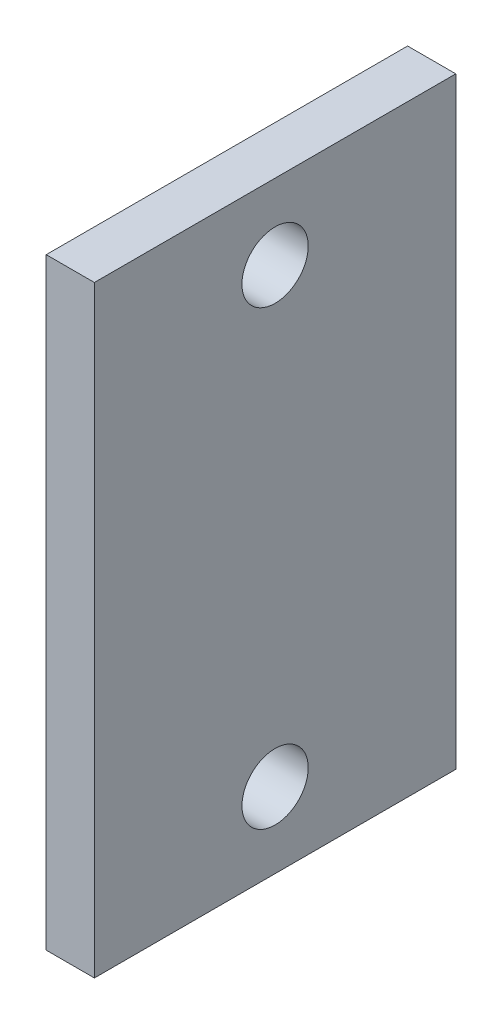
ISO-10303-21;
HEADER;
FILE_DESCRIPTION(('STEP AP214'),'2;1');
FILE_NAME('part.step','',(''),(''),'','','');
FILE_SCHEMA(('AUTOMOTIVE_DESIGN { 1 0 10303 214 1 1 1 1 }'));
ENDSEC;
DATA;
#1=APPLICATION_CONTEXT('core data for automotive mechanical design processes');
#2=APPLICATION_PROTOCOL_DEFINITION('international standard','automotive_design',2000,#1);
#3=PRODUCT_CONTEXT('',#1,'mechanical');
#4=PRODUCT('Part','Part','',(#3));
#5=PRODUCT_RELATED_PRODUCT_CATEGORY('part','',(#4));
#6=PRODUCT_DEFINITION_FORMATION('','',#4);
#7=PRODUCT_DEFINITION_CONTEXT('part definition',#1,'design');
#8=PRODUCT_DEFINITION('design','',#6,#7);
#9=PRODUCT_DEFINITION_SHAPE('','',#8);
#10=(LENGTH_UNIT() NAMED_UNIT(*) SI_UNIT(.MILLI.,.METRE.));
#11=(NAMED_UNIT(*) PLANE_ANGLE_UNIT() SI_UNIT($,.RADIAN.));
#12=(NAMED_UNIT(*) SI_UNIT($,.STERADIAN.) SOLID_ANGLE_UNIT());
#13=UNCERTAINTY_MEASURE_WITH_UNIT(LENGTH_MEASURE(1.E-05),#10,'distance_accuracy_value','');
#14=(GEOMETRIC_REPRESENTATION_CONTEXT(3) GLOBAL_UNCERTAINTY_ASSIGNED_CONTEXT((#13)) GLOBAL_UNIT_ASSIGNED_CONTEXT((#10,
#11,#12)) REPRESENTATION_CONTEXT('',''));
#15=CARTESIAN_POINT('',(0.,0.,0.));
#16=DIRECTION('',(0.,0.,1.));
#17=DIRECTION('',(1.,0.,0.));
#18=AXIS2_PLACEMENT_3D('',#15,#16,#17);
#19=CARTESIAN_POINT('',(0.,0.,0.));
#20=DIRECTION('',(-1.,0.,0.));
#21=DIRECTION('',(0.,0.,1.));
#22=AXIS2_PLACEMENT_3D('',#19,#20,#21);
#23=PLANE('',#22);
#24=CARTESIAN_POINT('',(0.,-7.5,0.));
#25=DIRECTION('',(-1.,0.,0.));
#26=DIRECTION('',(0.,0.,1.));
#27=AXIS2_PLACEMENT_3D('',#24,#25,#26);
#28=CIRCLE('',#27,1.1);
#29=CARTESIAN_POINT('',(0.,-7.5,1.1));
#30=VERTEX_POINT('',#29);
#31=EDGE_CURVE('E149',#30,#30,#28,.F.);
#32=ORIENTED_EDGE('',*,*,#31,.T.);
#33=EDGE_LOOP('',(#32));
#34=FACE_BOUND('',#33,.T.);
#35=CARTESIAN_POINT('',(0.,7.5,0.));
#36=DIRECTION('',(-1.,0.,0.));
#37=DIRECTION('',(0.,0.,1.));
#38=AXIS2_PLACEMENT_3D('',#35,#36,#37);
#39=CIRCLE('',#38,1.1);
#40=CARTESIAN_POINT('',(0.,7.5,1.1));
#41=VERTEX_POINT('',#40);
#42=EDGE_CURVE('E244',#41,#41,#39,.F.);
#43=ORIENTED_EDGE('',*,*,#42,.T.);
#44=EDGE_LOOP('',(#43));
#45=FACE_BOUND('',#44,.T.);
#46=DIRECTION('',(0.,1.,0.));
#47=VECTOR('',#46,1.);
#48=CARTESIAN_POINT('',(0.,-10.,-6.));
#49=LINE('',#48,#47);
#50=CARTESIAN_POINT('',(0.,-10.,-6.));
#51=VERTEX_POINT('',#50);
#52=CARTESIAN_POINT('',(0.,10.,-6.));
#53=VERTEX_POINT('',#52);
#54=EDGE_CURVE('E157',#51,#53,#49,.T.);
#55=ORIENTED_EDGE('',*,*,#54,.F.);
#56=DIRECTION('',(0.,0.,-1.));
#57=VECTOR('',#56,1.);
#58=CARTESIAN_POINT('',(0.,-10.,6.));
#59=LINE('',#58,#57);
#60=CARTESIAN_POINT('',(0.,-10.,6.));
#61=VERTEX_POINT('',#60);
#62=EDGE_CURVE('E95',#61,#51,#59,.T.);
#63=ORIENTED_EDGE('',*,*,#62,.F.);
#64=DIRECTION('',(0.,-1.,0.));
#65=VECTOR('',#64,1.);
#66=CARTESIAN_POINT('',(0.,-10.,6.));
#67=LINE('',#66,#65);
#68=CARTESIAN_POINT('',(0.,10.,6.));
#69=VERTEX_POINT('',#68);
#70=EDGE_CURVE('E171',#69,#61,#67,.T.);
#71=ORIENTED_EDGE('',*,*,#70,.F.);
#72=DIRECTION('',(0.,0.,1.));
#73=VECTOR('',#72,1.);
#74=CARTESIAN_POINT('',(0.,10.,6.));
#75=LINE('',#74,#73);
#76=EDGE_CURVE('E174',#53,#69,#75,.T.);
#77=ORIENTED_EDGE('',*,*,#76,.F.);
#78=EDGE_LOOP('',(#55,#63,#71,#77));
#79=FACE_BOUND('',#78,.T.);
#80=DIRECTION('',(0.,0.,1.));
#81=VECTOR('',#80,1.);
#82=CARTESIAN_POINT('',(0.,1.75,-1.4));
#83=LINE('',#82,#81);
#84=CARTESIAN_POINT('',(0.,1.75,-1.4));
#85=VERTEX_POINT('',#84);
#86=CARTESIAN_POINT('',(0.,1.75,1.4));
#87=VERTEX_POINT('',#86);
#88=EDGE_CURVE('E141',#85,#87,#83,.T.);
#89=ORIENTED_EDGE('',*,*,#88,.T.);
#90=DIRECTION('',(0.,-1.,0.));
#91=VECTOR('',#90,1.);
#92=CARTESIAN_POINT('',(0.,1.75,1.4));
#93=LINE('',#92,#91);
#94=CARTESIAN_POINT('',(0.,-1.75,1.4));
#95=VERTEX_POINT('',#94);
#96=EDGE_CURVE('E64',#87,#95,#93,.T.);
#97=ORIENTED_EDGE('',*,*,#96,.T.);
#98=DIRECTION('',(0.,0.,-1.));
#99=VECTOR('',#98,1.);
#100=CARTESIAN_POINT('',(0.,-1.75,1.4));
#101=LINE('',#100,#99);
#102=CARTESIAN_POINT('',(0.,-1.75,-1.4));
#103=VERTEX_POINT('',#102);
#104=EDGE_CURVE('E127',#95,#103,#101,.T.);
#105=ORIENTED_EDGE('',*,*,#104,.T.);
#106=DIRECTION('',(0.,1.,0.));
#107=VECTOR('',#106,1.);
#108=CARTESIAN_POINT('',(0.,-1.75,-1.4));
#109=LINE('',#108,#107);
#110=EDGE_CURVE('E148',#103,#85,#109,.T.);
#111=ORIENTED_EDGE('',*,*,#110,.T.);
#112=EDGE_LOOP('',(#89,#97,#105,#111));
#113=FACE_BOUND('',#112,.T.);
#114=ADVANCED_FACE('F50',(#34,#45,#79,#113),#23,.T.);
#115=CARTESIAN_POINT('',(1.6,-10.,-6.));
#116=DIRECTION('',(0.,0.,1.));
#117=DIRECTION('',(1.,0.,0.));
#118=AXIS2_PLACEMENT_3D('',#115,#116,#117);
#119=PLANE('',#118);
#120=ORIENTED_EDGE('',*,*,#54,.T.);
#121=DIRECTION('',(-1.,0.,0.));
#122=VECTOR('',#121,1.);
#123=CARTESIAN_POINT('',(1.6,10.,-6.));
#124=LINE('',#123,#122);
#125=CARTESIAN_POINT('',(1.6,10.,-6.));
#126=VERTEX_POINT('',#125);
#127=EDGE_CURVE('E11',#126,#53,#124,.T.);
#128=ORIENTED_EDGE('',*,*,#127,.F.);
#129=DIRECTION('',(0.,1.,0.));
#130=VECTOR('',#129,1.);
#131=CARTESIAN_POINT('',(1.6,-10.,-6.));
#132=LINE('',#131,#130);
#133=CARTESIAN_POINT('',(1.6,-10.,-6.));
#134=VERTEX_POINT('',#133);
#135=EDGE_CURVE('E162',#134,#126,#132,.T.);
#136=ORIENTED_EDGE('',*,*,#135,.F.);
#137=DIRECTION('',(-1.,0.,0.));
#138=VECTOR('',#137,1.);
#139=CARTESIAN_POINT('',(1.6,-10.,-6.));
#140=LINE('',#139,#138);
#141=EDGE_CURVE('E166',#134,#51,#140,.T.);
#142=ORIENTED_EDGE('',*,*,#141,.T.);
#143=EDGE_LOOP('',(#120,#128,#136,#142));
#144=FACE_BOUND('',#143,.T.);
#145=ADVANCED_FACE('F47',(#144),#119,.F.);
#146=CARTESIAN_POINT('',(1.6,10.,6.));
#147=DIRECTION('',(0.,-1.,0.));
#148=DIRECTION('',(0.,0.,-1.));
#149=AXIS2_PLACEMENT_3D('',#146,#147,#148);
#150=PLANE('',#149);
#151=ORIENTED_EDGE('',*,*,#76,.T.);
#152=DIRECTION('',(-1.,0.,0.));
#153=VECTOR('',#152,1.);
#154=CARTESIAN_POINT('',(1.6,10.,6.));
#155=LINE('',#154,#153);
#156=CARTESIAN_POINT('',(1.6,10.,6.));
#157=VERTEX_POINT('',#156);
#158=EDGE_CURVE('E54',#157,#69,#155,.T.);
#159=ORIENTED_EDGE('',*,*,#158,.F.);
#160=DIRECTION('',(0.,0.,1.));
#161=VECTOR('',#160,1.);
#162=CARTESIAN_POINT('',(1.6,10.,6.));
#163=LINE('',#162,#161);
#164=EDGE_CURVE('E97',#126,#157,#163,.T.);
#165=ORIENTED_EDGE('',*,*,#164,.F.);
#166=ORIENTED_EDGE('',*,*,#127,.T.);
#167=EDGE_LOOP('',(#151,#159,#165,#166));
#168=FACE_BOUND('',#167,.T.);
#169=ADVANCED_FACE('F205',(#168),#150,.F.);
#170=CARTESIAN_POINT('',(1.6,-10.,6.));
#171=DIRECTION('',(0.,0.,-1.));
#172=DIRECTION('',(-1.,0.,0.));
#173=AXIS2_PLACEMENT_3D('',#170,#171,#172);
#174=PLANE('',#173);
#175=ORIENTED_EDGE('',*,*,#70,.T.);
#176=DIRECTION('',(-1.,0.,0.));
#177=VECTOR('',#176,1.);
#178=CARTESIAN_POINT('',(1.6,-10.,6.));
#179=LINE('',#178,#177);
#180=CARTESIAN_POINT('',(1.6,-10.,6.));
#181=VERTEX_POINT('',#180);
#182=EDGE_CURVE('E177',#181,#61,#179,.T.);
#183=ORIENTED_EDGE('',*,*,#182,.F.);
#184=DIRECTION('',(0.,-1.,0.));
#185=VECTOR('',#184,1.);
#186=CARTESIAN_POINT('',(1.6,-10.,6.));
#187=LINE('',#186,#185);
#188=EDGE_CURVE('E167',#157,#181,#187,.T.);
#189=ORIENTED_EDGE('',*,*,#188,.F.);
#190=ORIENTED_EDGE('',*,*,#158,.T.);
#191=EDGE_LOOP('',(#175,#183,#189,#190));
#192=FACE_BOUND('',#191,.T.);
#193=ADVANCED_FACE('F181',(#192),#174,.F.);
#194=CARTESIAN_POINT('',(1.6,-10.,6.));
#195=DIRECTION('',(0.,1.,0.));
#196=DIRECTION('',(0.,0.,1.));
#197=AXIS2_PLACEMENT_3D('',#194,#195,#196);
#198=PLANE('',#197);
#199=ORIENTED_EDGE('',*,*,#62,.T.);
#200=ORIENTED_EDGE('',*,*,#141,.F.);
#201=DIRECTION('',(0.,0.,-1.));
#202=VECTOR('',#201,1.);
#203=CARTESIAN_POINT('',(1.6,-10.,6.));
#204=LINE('',#203,#202);
#205=EDGE_CURVE('E72',#181,#134,#204,.T.);
#206=ORIENTED_EDGE('',*,*,#205,.F.);
#207=ORIENTED_EDGE('',*,*,#182,.T.);
#208=EDGE_LOOP('',(#199,#200,#206,#207));
#209=FACE_BOUND('',#208,.T.);
#210=ADVANCED_FACE('F191',(#209),#198,.F.);
#211=CARTESIAN_POINT('',(1.6,0.,0.));
#212=DIRECTION('',(-1.,0.,0.));
#213=DIRECTION('',(0.,0.,1.));
#214=AXIS2_PLACEMENT_3D('',#211,#212,#213);
#215=PLANE('',#214);
#216=CARTESIAN_POINT('',(1.6,-7.5,0.));
#217=DIRECTION('',(1.,0.,0.));
#218=DIRECTION('',(0.,0.,-1.));
#219=AXIS2_PLACEMENT_3D('',#216,#217,#218);
#220=CIRCLE('',#219,1.1);
#221=CARTESIAN_POINT('',(1.6,-7.5,-1.1));
#222=VERTEX_POINT('',#221);
#223=EDGE_CURVE('E242',#222,#222,#220,.T.);
#224=ORIENTED_EDGE('',*,*,#223,.F.);
#225=EDGE_LOOP('',(#224));
#226=FACE_BOUND('',#225,.T.);
#227=CARTESIAN_POINT('',(1.6,7.5,0.));
#228=DIRECTION('',(1.,0.,0.));
#229=DIRECTION('',(0.,0.,-1.));
#230=AXIS2_PLACEMENT_3D('',#227,#228,#229);
#231=CIRCLE('',#230,1.1);
#232=CARTESIAN_POINT('',(1.6,7.5,-1.1));
#233=VERTEX_POINT('',#232);
#234=EDGE_CURVE('E245',#233,#233,#231,.T.);
#235=ORIENTED_EDGE('',*,*,#234,.F.);
#236=EDGE_LOOP('',(#235));
#237=FACE_BOUND('',#236,.T.);
#238=ORIENTED_EDGE('',*,*,#135,.T.);
#239=ORIENTED_EDGE('',*,*,#164,.T.);
#240=ORIENTED_EDGE('',*,*,#188,.T.);
#241=ORIENTED_EDGE('',*,*,#205,.T.);
#242=EDGE_LOOP('',(#238,#239,#240,#241));
#243=FACE_BOUND('',#242,.T.);
#244=ADVANCED_FACE('F192',(#226,#237,#243),#215,.F.);
#245=CARTESIAN_POINT('',(-1.2,1.75,1.4));
#246=DIRECTION('',(0.,0.,1.));
#247=DIRECTION('',(1.,0.,0.));
#248=AXIS2_PLACEMENT_3D('',#245,#246,#247);
#249=PLANE('',#248);
#250=ORIENTED_EDGE('',*,*,#96,.F.);
#251=DIRECTION('',(1.,0.,0.));
#252=VECTOR('',#251,1.);
#253=CARTESIAN_POINT('',(-1.2,1.75,1.4));
#254=LINE('',#253,#252);
#255=CARTESIAN_POINT('',(-1.2,1.75,1.4));
#256=VERTEX_POINT('',#255);
#257=EDGE_CURVE('E142',#256,#87,#254,.T.);
#258=ORIENTED_EDGE('',*,*,#257,.F.);
#259=DIRECTION('',(0.,-1.,0.));
#260=VECTOR('',#259,1.);
#261=CARTESIAN_POINT('',(-1.2,1.75,1.4));
#262=LINE('',#261,#260);
#263=CARTESIAN_POINT('',(-1.2,-1.75,1.4));
#264=VERTEX_POINT('',#263);
#265=EDGE_CURVE('E136',#256,#264,#262,.T.);
#266=ORIENTED_EDGE('',*,*,#265,.T.);
#267=DIRECTION('',(1.,0.,0.));
#268=VECTOR('',#267,1.);
#269=CARTESIAN_POINT('',(-1.2,-1.75,1.4));
#270=LINE('',#269,#268);
#271=EDGE_CURVE('E121',#264,#95,#270,.T.);
#272=ORIENTED_EDGE('',*,*,#271,.T.);
#273=EDGE_LOOP('',(#250,#258,#266,#272));
#274=FACE_BOUND('',#273,.T.);
#275=ADVANCED_FACE('F143',(#274),#249,.T.);
#276=CARTESIAN_POINT('',(-1.2,1.75,-1.4));
#277=DIRECTION('',(0.,1.,0.));
#278=DIRECTION('',(0.,0.,1.));
#279=AXIS2_PLACEMENT_3D('',#276,#277,#278);
#280=PLANE('',#279);
#281=ORIENTED_EDGE('',*,*,#88,.F.);
#282=DIRECTION('',(1.,0.,0.));
#283=VECTOR('',#282,1.);
#284=CARTESIAN_POINT('',(-1.2,1.75,-1.4));
#285=LINE('',#284,#283);
#286=CARTESIAN_POINT('',(-1.2,1.75,-1.4));
#287=VERTEX_POINT('',#286);
#288=EDGE_CURVE('E159',#287,#85,#285,.T.);
#289=ORIENTED_EDGE('',*,*,#288,.F.);
#290=DIRECTION('',(0.,0.,1.));
#291=VECTOR('',#290,1.);
#292=CARTESIAN_POINT('',(-1.2,1.75,-1.4));
#293=LINE('',#292,#291);
#294=EDGE_CURVE('E129',#287,#256,#293,.T.);
#295=ORIENTED_EDGE('',*,*,#294,.T.);
#296=ORIENTED_EDGE('',*,*,#257,.T.);
#297=EDGE_LOOP('',(#281,#289,#295,#296));
#298=FACE_BOUND('',#297,.T.);
#299=ADVANCED_FACE('F216',(#298),#280,.T.);
#300=CARTESIAN_POINT('',(-1.2,-1.75,-1.4));
#301=DIRECTION('',(0.,0.,-1.));
#302=DIRECTION('',(-1.,0.,0.));
#303=AXIS2_PLACEMENT_3D('',#300,#301,#302);
#304=PLANE('',#303);
#305=ORIENTED_EDGE('',*,*,#110,.F.);
#306=DIRECTION('',(1.,0.,0.));
#307=VECTOR('',#306,1.);
#308=CARTESIAN_POINT('',(-1.2,-1.75,-1.4));
#309=LINE('',#308,#307);
#310=CARTESIAN_POINT('',(-1.2,-1.75,-1.4));
#311=VERTEX_POINT('',#310);
#312=EDGE_CURVE('E126',#311,#103,#309,.T.);
#313=ORIENTED_EDGE('',*,*,#312,.F.);
#314=DIRECTION('',(0.,1.,0.));
#315=VECTOR('',#314,1.);
#316=CARTESIAN_POINT('',(-1.2,-1.75,-1.4));
#317=LINE('',#316,#315);
#318=EDGE_CURVE('E138',#311,#287,#317,.T.);
#319=ORIENTED_EDGE('',*,*,#318,.T.);
#320=ORIENTED_EDGE('',*,*,#288,.T.);
#321=EDGE_LOOP('',(#305,#313,#319,#320));
#322=FACE_BOUND('',#321,.T.);
#323=ADVANCED_FACE('F218',(#322),#304,.T.);
#324=CARTESIAN_POINT('',(-1.2,-1.75,1.4));
#325=DIRECTION('',(0.,-1.,0.));
#326=DIRECTION('',(0.,0.,-1.));
#327=AXIS2_PLACEMENT_3D('',#324,#325,#326);
#328=PLANE('',#327);
#329=ORIENTED_EDGE('',*,*,#104,.F.);
#330=ORIENTED_EDGE('',*,*,#271,.F.);
#331=DIRECTION('',(0.,0.,-1.));
#332=VECTOR('',#331,1.);
#333=CARTESIAN_POINT('',(-1.2,-1.75,1.4));
#334=LINE('',#333,#332);
#335=EDGE_CURVE('E123',#264,#311,#334,.T.);
#336=ORIENTED_EDGE('',*,*,#335,.T.);
#337=ORIENTED_EDGE('',*,*,#312,.T.);
#338=EDGE_LOOP('',(#329,#330,#336,#337));
#339=FACE_BOUND('',#338,.T.);
#340=ADVANCED_FACE('F122',(#339),#328,.T.);
#341=CARTESIAN_POINT('',(-1.2,0.,0.));
#342=DIRECTION('',(1.,0.,0.));
#343=DIRECTION('',(0.,0.,-1.));
#344=AXIS2_PLACEMENT_3D('',#341,#342,#343);
#345=PLANE('',#344);
#346=ORIENTED_EDGE('',*,*,#265,.F.);
#347=ORIENTED_EDGE('',*,*,#294,.F.);
#348=ORIENTED_EDGE('',*,*,#318,.F.);
#349=ORIENTED_EDGE('',*,*,#335,.F.);
#350=EDGE_LOOP('',(#346,#347,#348,#349));
#351=FACE_BOUND('',#350,.T.);
#352=ADVANCED_FACE('F131',(#351),#345,.F.);
#353=CARTESIAN_POINT('',(1.6,7.5,0.));
#354=DIRECTION('',(-1.,0.,0.));
#355=DIRECTION('',(0.,0.,1.));
#356=AXIS2_PLACEMENT_3D('',#353,#354,#355);
#357=CYLINDRICAL_SURFACE('',#356,1.1);
#358=ORIENTED_EDGE('',*,*,#42,.F.);
#359=EDGE_LOOP('',(#358));
#360=FACE_BOUND('',#359,.T.);
#361=ORIENTED_EDGE('',*,*,#234,.T.);
#362=EDGE_LOOP('',(#361));
#363=FACE_BOUND('',#362,.T.);
#364=ADVANCED_FACE('F230',(#360,#363),#357,.F.);
#365=CARTESIAN_POINT('',(1.6,-7.5,0.));
#366=DIRECTION('',(-1.,0.,0.));
#367=DIRECTION('',(0.,0.,1.));
#368=AXIS2_PLACEMENT_3D('',#365,#366,#367);
#369=CYLINDRICAL_SURFACE('',#368,1.1);
#370=ORIENTED_EDGE('',*,*,#31,.F.);
#371=EDGE_LOOP('',(#370));
#372=FACE_BOUND('',#371,.T.);
#373=ORIENTED_EDGE('',*,*,#223,.T.);
#374=EDGE_LOOP('',(#373));
#375=FACE_BOUND('',#374,.T.);
#376=ADVANCED_FACE('F231',(#372,#375),#369,.F.);
#377=CLOSED_SHELL('',(#114,#145,#169,#193,#210,#244,#275,#299,#323,#340,#352,#364,#376));
#378=MANIFOLD_SOLID_BREP('B2',#377);
#379=ADVANCED_BREP_SHAPE_REPRESENTATION('',(#18,#378),#14);
#380=SHAPE_DEFINITION_REPRESENTATION(#9,#379);
ENDSEC;
END-ISO-10303-21;
